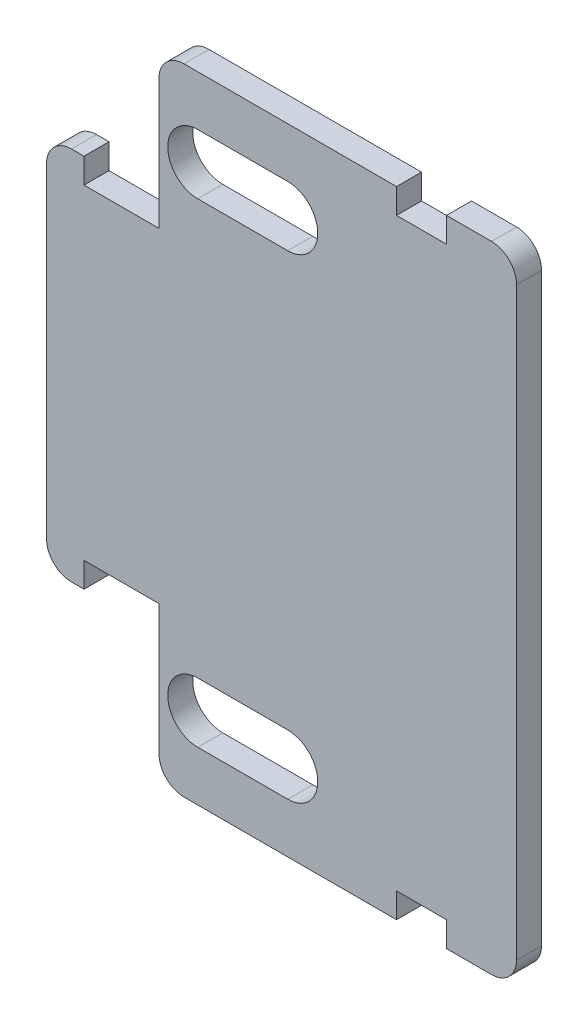
ISO-10303-21;
HEADER;
FILE_DESCRIPTION(('STEP AP214'),'2;1');
FILE_NAME('part.step','',(''),(''),'','','');
FILE_SCHEMA(('AUTOMOTIVE_DESIGN { 1 0 10303 214 1 1 1 1 }'));
ENDSEC;
DATA;
#1=APPLICATION_CONTEXT('core data for automotive mechanical design processes');
#2=APPLICATION_PROTOCOL_DEFINITION('international standard','automotive_design',2000,#1);
#3=PRODUCT_CONTEXT('',#1,'mechanical');
#4=PRODUCT('Part','Part','',(#3));
#5=PRODUCT_RELATED_PRODUCT_CATEGORY('part','',(#4));
#6=PRODUCT_DEFINITION_FORMATION('','',#4);
#7=PRODUCT_DEFINITION_CONTEXT('part definition',#1,'design');
#8=PRODUCT_DEFINITION('design','',#6,#7);
#9=PRODUCT_DEFINITION_SHAPE('','',#8);
#10=(LENGTH_UNIT() NAMED_UNIT(*) SI_UNIT(.MILLI.,.METRE.));
#11=(NAMED_UNIT(*) PLANE_ANGLE_UNIT() SI_UNIT($,.RADIAN.));
#12=(NAMED_UNIT(*) SI_UNIT($,.STERADIAN.) SOLID_ANGLE_UNIT());
#13=UNCERTAINTY_MEASURE_WITH_UNIT(LENGTH_MEASURE(1.E-05),#10,'distance_accuracy_value','');
#14=(GEOMETRIC_REPRESENTATION_CONTEXT(3) GLOBAL_UNCERTAINTY_ASSIGNED_CONTEXT((#13)) GLOBAL_UNIT_ASSIGNED_CONTEXT((#10,
#11,#12)) REPRESENTATION_CONTEXT('',''));
#15=CARTESIAN_POINT('',(0.,0.,0.));
#16=DIRECTION('',(0.,0.,1.));
#17=DIRECTION('',(1.,0.,0.));
#18=AXIS2_PLACEMENT_3D('',#15,#16,#17);
#19=CARTESIAN_POINT('',(0.,53.5,5.));
#20=DIRECTION('',(0.,1.,0.));
#21=DIRECTION('',(0.,0.,1.));
#22=AXIS2_PLACEMENT_3D('',#19,#20,#21);
#23=PLANE('',#22);
#24=DIRECTION('',(1.,0.,0.));
#25=VECTOR('',#24,1.);
#26=CARTESIAN_POINT('',(0.,53.5,0.));
#27=LINE('',#26,#25);
#28=CARTESIAN_POINT('',(-44.75,53.5,0.));
#29=VERTEX_POINT('',#28);
#30=CARTESIAN_POINT('',(-26.75,53.5,0.));
#31=VERTEX_POINT('',#30);
#32=EDGE_CURVE('E403',#29,#31,#27,.T.);
#33=ORIENTED_EDGE('',*,*,#32,.T.);
#34=DIRECTION('',(0.,0.,-1.));
#35=VECTOR('',#34,1.);
#36=CARTESIAN_POINT('',(-26.75,53.5,5.));
#37=LINE('',#36,#35);
#38=CARTESIAN_POINT('',(-26.75,53.5,5.));
#39=VERTEX_POINT('',#38);
#40=EDGE_CURVE('E302',#39,#31,#37,.T.);
#41=ORIENTED_EDGE('',*,*,#40,.F.);
#42=DIRECTION('',(1.,0.,0.));
#43=VECTOR('',#42,1.);
#44=CARTESIAN_POINT('',(0.,53.5,5.));
#45=LINE('',#44,#43);
#46=CARTESIAN_POINT('',(-44.75,53.5,5.));
#47=VERTEX_POINT('',#46);
#48=EDGE_CURVE('E557',#47,#39,#45,.T.);
#49=ORIENTED_EDGE('',*,*,#48,.F.);
#50=DIRECTION('',(0.,0.,-1.));
#51=VECTOR('',#50,1.);
#52=CARTESIAN_POINT('',(-44.75,53.5,5.));
#53=LINE('',#52,#51);
#54=EDGE_CURVE('E413',#47,#29,#53,.T.);
#55=ORIENTED_EDGE('',*,*,#54,.T.);
#56=EDGE_LOOP('',(#33,#41,#49,#55));
#57=FACE_BOUND('',#56,.T.);
#58=ADVANCED_FACE('F41',(#57),#23,.F.);
#59=CARTESIAN_POINT('',(-26.7499999999999,47.5,5.));
#60=DIRECTION('',(0.,0.,-1.));
#61=DIRECTION('',(-1.,0.,0.));
#62=AXIS2_PLACEMENT_3D('',#59,#60,#61);
#63=CYLINDRICAL_SURFACE('',#62,6.);
#64=CARTESIAN_POINT('',(-26.7499999999999,47.5,0.));
#65=DIRECTION('',(0.,0.,1.));
#66=DIRECTION('',(1.,0.,0.));
#67=AXIS2_PLACEMENT_3D('',#64,#65,#66);
#68=CIRCLE('',#67,6.);
#69=CARTESIAN_POINT('',(-26.75,41.5,0.));
#70=VERTEX_POINT('',#69);
#71=EDGE_CURVE('E406',#31,#70,#68,.F.);
#72=ORIENTED_EDGE('',*,*,#71,.T.);
#73=DIRECTION('',(0.,0.,-1.));
#74=VECTOR('',#73,1.);
#75=CARTESIAN_POINT('',(-26.75,41.5,5.));
#76=LINE('',#75,#74);
#77=CARTESIAN_POINT('',(-26.75,41.5,5.));
#78=VERTEX_POINT('',#77);
#79=EDGE_CURVE('E419',#78,#70,#76,.T.);
#80=ORIENTED_EDGE('',*,*,#79,.F.);
#81=CARTESIAN_POINT('',(-26.7499999999999,47.5,5.));
#82=DIRECTION('',(0.,0.,1.));
#83=DIRECTION('',(1.,0.,0.));
#84=AXIS2_PLACEMENT_3D('',#81,#82,#83);
#85=CIRCLE('',#84,6.);
#86=EDGE_CURVE('E560',#39,#78,#85,.F.);
#87=ORIENTED_EDGE('',*,*,#86,.F.);
#88=ORIENTED_EDGE('',*,*,#40,.T.);
#89=EDGE_LOOP('',(#72,#80,#87,#88));
#90=FACE_BOUND('',#89,.T.);
#91=ADVANCED_FACE('F594',(#90),#63,.F.);
#92=CARTESIAN_POINT('',(0.,41.5,5.));
#93=DIRECTION('',(0.,1.,0.));
#94=DIRECTION('',(0.,0.,1.));
#95=AXIS2_PLACEMENT_3D('',#92,#93,#94);
#96=PLANE('',#95);
#97=DIRECTION('',(1.,0.,0.));
#98=VECTOR('',#97,1.);
#99=CARTESIAN_POINT('',(0.,41.5,0.));
#100=LINE('',#99,#98);
#101=CARTESIAN_POINT('',(-44.75,41.5,0.));
#102=VERTEX_POINT('',#101);
#103=EDGE_CURVE('E409',#102,#70,#100,.T.);
#104=ORIENTED_EDGE('',*,*,#103,.F.);
#105=DIRECTION('',(0.,0.,-1.));
#106=VECTOR('',#105,1.);
#107=CARTESIAN_POINT('',(-44.75,41.5,5.));
#108=LINE('',#107,#106);
#109=CARTESIAN_POINT('',(-44.75,41.5,5.));
#110=VERTEX_POINT('',#109);
#111=EDGE_CURVE('E416',#110,#102,#108,.T.);
#112=ORIENTED_EDGE('',*,*,#111,.F.);
#113=DIRECTION('',(1.,0.,0.));
#114=VECTOR('',#113,1.);
#115=CARTESIAN_POINT('',(0.,41.5,5.));
#116=LINE('',#115,#114);
#117=EDGE_CURVE('E562',#110,#78,#116,.T.);
#118=ORIENTED_EDGE('',*,*,#117,.T.);
#119=ORIENTED_EDGE('',*,*,#79,.T.);
#120=EDGE_LOOP('',(#104,#112,#118,#119));
#121=FACE_BOUND('',#120,.T.);
#122=ADVANCED_FACE('F600',(#121),#96,.T.);
#123=CARTESIAN_POINT('',(-26.7499999999999,-47.5,5.));
#124=DIRECTION('',(0.,0.,-1.));
#125=DIRECTION('',(-1.,0.,0.));
#126=AXIS2_PLACEMENT_3D('',#123,#124,#125);
#127=CYLINDRICAL_SURFACE('',#126,6.);
#128=CARTESIAN_POINT('',(-26.7499999999999,-47.5,0.));
#129=DIRECTION('',(0.,0.,1.));
#130=DIRECTION('',(1.,0.,0.));
#131=AXIS2_PLACEMENT_3D('',#128,#129,#130);
#132=CIRCLE('',#131,6.);
#133=CARTESIAN_POINT('',(-26.75,-53.5,0.));
#134=VERTEX_POINT('',#133);
#135=CARTESIAN_POINT('',(-26.75,-41.5,0.));
#136=VERTEX_POINT('',#135);
#137=EDGE_CURVE('E391',#134,#136,#132,.T.);
#138=ORIENTED_EDGE('',*,*,#137,.F.);
#139=DIRECTION('',(0.,0.,-1.));
#140=VECTOR('',#139,1.);
#141=CARTESIAN_POINT('',(-26.75,-53.5,5.));
#142=LINE('',#141,#140);
#143=CARTESIAN_POINT('',(-26.75,-53.5,5.));
#144=VERTEX_POINT('',#143);
#145=EDGE_CURVE('E417',#144,#134,#142,.T.);
#146=ORIENTED_EDGE('',*,*,#145,.F.);
#147=CARTESIAN_POINT('',(-26.7499999999999,-47.5,5.));
#148=DIRECTION('',(0.,0.,1.));
#149=DIRECTION('',(1.,0.,0.));
#150=AXIS2_PLACEMENT_3D('',#147,#148,#149);
#151=CIRCLE('',#150,6.);
#152=CARTESIAN_POINT('',(-26.75,-41.5,5.));
#153=VERTEX_POINT('',#152);
#154=EDGE_CURVE('E546',#144,#153,#151,.T.);
#155=ORIENTED_EDGE('',*,*,#154,.T.);
#156=DIRECTION('',(0.,0.,-1.));
#157=VECTOR('',#156,1.);
#158=CARTESIAN_POINT('',(-26.75,-41.5,5.));
#159=LINE('',#158,#157);
#160=EDGE_CURVE('E290',#153,#136,#159,.T.);
#161=ORIENTED_EDGE('',*,*,#160,.T.);
#162=EDGE_LOOP('',(#138,#146,#155,#161));
#163=FACE_BOUND('',#162,.T.);
#164=ADVANCED_FACE('F618',(#163),#127,.F.);
#165=CARTESIAN_POINT('',(0.,-53.5,5.));
#166=DIRECTION('',(0.,1.,0.));
#167=DIRECTION('',(0.,0.,1.));
#168=AXIS2_PLACEMENT_3D('',#165,#166,#167);
#169=PLANE('',#168);
#170=DIRECTION('',(1.,0.,0.));
#171=VECTOR('',#170,1.);
#172=CARTESIAN_POINT('',(0.,-53.5,0.));
#173=LINE('',#172,#171);
#174=CARTESIAN_POINT('',(-44.75,-53.5,0.));
#175=VERTEX_POINT('',#174);
#176=EDGE_CURVE('E394',#175,#134,#173,.T.);
#177=ORIENTED_EDGE('',*,*,#176,.F.);
#178=DIRECTION('',(0.,0.,-1.));
#179=VECTOR('',#178,1.);
#180=CARTESIAN_POINT('',(-44.75,-53.5,5.));
#181=LINE('',#180,#179);
#182=CARTESIAN_POINT('',(-44.75,-53.5,5.));
#183=VERTEX_POINT('',#182);
#184=EDGE_CURVE('E424',#183,#175,#181,.T.);
#185=ORIENTED_EDGE('',*,*,#184,.F.);
#186=DIRECTION('',(1.,0.,0.));
#187=VECTOR('',#186,1.);
#188=CARTESIAN_POINT('',(0.,-53.5,5.));
#189=LINE('',#188,#187);
#190=EDGE_CURVE('E549',#183,#144,#189,.T.);
#191=ORIENTED_EDGE('',*,*,#190,.T.);
#192=ORIENTED_EDGE('',*,*,#145,.T.);
#193=EDGE_LOOP('',(#177,#185,#191,#192));
#194=FACE_BOUND('',#193,.T.);
#195=ADVANCED_FACE('F614',(#194),#169,.T.);
#196=CARTESIAN_POINT('',(-44.7500000000001,-47.5,5.));
#197=DIRECTION('',(0.,0.,-1.));
#198=DIRECTION('',(-1.,0.,0.));
#199=AXIS2_PLACEMENT_3D('',#196,#197,#198);
#200=CYLINDRICAL_SURFACE('',#199,6.);
#201=CARTESIAN_POINT('',(-44.7500000000001,-47.5,0.));
#202=DIRECTION('',(0.,0.,1.));
#203=DIRECTION('',(1.,0.,0.));
#204=AXIS2_PLACEMENT_3D('',#201,#202,#203);
#205=CIRCLE('',#204,6.);
#206=CARTESIAN_POINT('',(-44.7500000000001,-41.5,0.));
#207=VERTEX_POINT('',#206);
#208=EDGE_CURVE('E397',#207,#175,#205,.T.);
#209=ORIENTED_EDGE('',*,*,#208,.F.);
#210=DIRECTION('',(0.,0.,-1.));
#211=VECTOR('',#210,1.);
#212=CARTESIAN_POINT('',(-44.7500000000001,-41.5,5.));
#213=LINE('',#212,#211);
#214=CARTESIAN_POINT('',(-44.7500000000001,-41.5,5.));
#215=VERTEX_POINT('',#214);
#216=EDGE_CURVE('E293',#215,#207,#213,.T.);
#217=ORIENTED_EDGE('',*,*,#216,.F.);
#218=CARTESIAN_POINT('',(-44.7500000000001,-47.5,5.));
#219=DIRECTION('',(0.,0.,1.));
#220=DIRECTION('',(1.,0.,0.));
#221=AXIS2_PLACEMENT_3D('',#218,#219,#220);
#222=CIRCLE('',#221,6.);
#223=EDGE_CURVE('E552',#215,#183,#222,.T.);
#224=ORIENTED_EDGE('',*,*,#223,.T.);
#225=ORIENTED_EDGE('',*,*,#184,.T.);
#226=EDGE_LOOP('',(#209,#217,#224,#225));
#227=FACE_BOUND('',#226,.T.);
#228=ADVANCED_FACE('F611',(#227),#200,.F.);
#229=CARTESIAN_POINT('',(-5.,0.,5.));
#230=DIRECTION('',(-1.,0.,0.));
#231=DIRECTION('',(0.,0.,1.));
#232=AXIS2_PLACEMENT_3D('',#229,#230,#231);
#233=PLANE('',#232);
#234=DIRECTION('',(0.,1.,0.));
#235=VECTOR('',#234,1.);
#236=CARTESIAN_POINT('',(-5.,0.,0.));
#237=LINE('',#236,#235);
#238=CARTESIAN_POINT('',(-5.,58.5,0.));
#239=VERTEX_POINT('',#238);
#240=CARTESIAN_POINT('',(-5.,63.5,0.));
#241=VERTEX_POINT('',#240);
#242=EDGE_CURVE('E289',#239,#241,#237,.T.);
#243=ORIENTED_EDGE('',*,*,#242,.T.);
#244=DIRECTION('',(0.,0.,-1.));
#245=VECTOR('',#244,1.);
#246=CARTESIAN_POINT('',(-5.,63.5,5.));
#247=LINE('',#246,#245);
#248=CARTESIAN_POINT('',(-5.,63.5,5.));
#249=VERTEX_POINT('',#248);
#250=EDGE_CURVE('E267',#249,#241,#247,.T.);
#251=ORIENTED_EDGE('',*,*,#250,.F.);
#252=DIRECTION('',(0.,1.,0.));
#253=VECTOR('',#252,1.);
#254=CARTESIAN_POINT('',(-5.,0.,5.));
#255=LINE('',#254,#253);
#256=CARTESIAN_POINT('',(-5.,58.5,5.));
#257=VERTEX_POINT('',#256);
#258=EDGE_CURVE('E273',#257,#249,#255,.T.);
#259=ORIENTED_EDGE('',*,*,#258,.F.);
#260=DIRECTION('',(0.,0.,-1.));
#261=VECTOR('',#260,1.);
#262=CARTESIAN_POINT('',(-5.,58.5,5.));
#263=LINE('',#262,#261);
#264=EDGE_CURVE('E427',#257,#239,#263,.T.);
#265=ORIENTED_EDGE('',*,*,#264,.T.);
#266=EDGE_LOOP('',(#243,#251,#259,#265));
#267=FACE_BOUND('',#266,.T.);
#268=ADVANCED_FACE('F287',(#267),#233,.F.);
#269=CARTESIAN_POINT('',(0.,63.5,5.));
#270=DIRECTION('',(0.,-1.,0.));
#271=DIRECTION('',(1.,0.,0.));
#272=AXIS2_PLACEMENT_3D('',#269,#270,#271);
#273=PLANE('',#272);
#274=DIRECTION('',(-1.,0.,0.));
#275=VECTOR('',#274,1.);
#276=CARTESIAN_POINT('',(0.,63.5,0.));
#277=LINE('',#276,#275);
#278=CARTESIAN_POINT('',(-47.5,63.5,0.));
#279=VERTEX_POINT('',#278);
#280=EDGE_CURVE('E567',#241,#279,#277,.T.);
#281=ORIENTED_EDGE('',*,*,#280,.T.);
#282=DIRECTION('',(0.,0.,-1.));
#283=VECTOR('',#282,1.);
#284=CARTESIAN_POINT('',(-47.5,63.5,5.));
#285=LINE('',#284,#283);
#286=CARTESIAN_POINT('',(-47.5,63.5,5.));
#287=VERTEX_POINT('',#286);
#288=EDGE_CURVE('E270',#279,#287,#285,.F.);
#289=ORIENTED_EDGE('',*,*,#288,.T.);
#290=DIRECTION('',(-1.,0.,0.));
#291=VECTOR('',#290,1.);
#292=CARTESIAN_POINT('',(0.,63.5,5.));
#293=LINE('',#292,#291);
#294=EDGE_CURVE('E262',#249,#287,#293,.T.);
#295=ORIENTED_EDGE('',*,*,#294,.F.);
#296=ORIENTED_EDGE('',*,*,#250,.T.);
#297=EDGE_LOOP('',(#281,#289,#295,#296));
#298=FACE_BOUND('',#297,.T.);
#299=ADVANCED_FACE('F265',(#298),#273,.F.);
#300=CARTESIAN_POINT('',(-52.5,0.,5.));
#301=DIRECTION('',(-1.,0.,0.));
#302=DIRECTION('',(0.,0.,1.));
#303=AXIS2_PLACEMENT_3D('',#300,#301,#302);
#304=PLANE('',#303);
#305=DIRECTION('',(0.,1.,0.));
#306=VECTOR('',#305,1.);
#307=CARTESIAN_POINT('',(-52.5,0.,5.));
#308=LINE('',#307,#306);
#309=CARTESIAN_POINT('',(-52.5,32.5,5.));
#310=VERTEX_POINT('',#309);
#311=CARTESIAN_POINT('',(-52.5,58.5,5.));
#312=VERTEX_POINT('',#311);
#313=EDGE_CURVE('E272',#310,#312,#308,.T.);
#314=ORIENTED_EDGE('',*,*,#313,.T.);
#315=DIRECTION('',(0.,0.,-1.));
#316=VECTOR('',#315,1.);
#317=CARTESIAN_POINT('',(-52.5,58.5,0.));
#318=LINE('',#317,#316);
#319=CARTESIAN_POINT('',(-52.5,58.5,0.));
#320=VERTEX_POINT('',#319);
#321=EDGE_CURVE('E332',#312,#320,#318,.T.);
#322=ORIENTED_EDGE('',*,*,#321,.T.);
#323=DIRECTION('',(0.,1.,0.));
#324=VECTOR('',#323,1.);
#325=CARTESIAN_POINT('',(-52.5,0.,0.));
#326=LINE('',#325,#324);
#327=CARTESIAN_POINT('',(-52.5,32.5,0.));
#328=VERTEX_POINT('',#327);
#329=EDGE_CURVE('E474',#328,#320,#326,.T.);
#330=ORIENTED_EDGE('',*,*,#329,.F.);
#331=DIRECTION('',(0.,0.,-1.));
#332=VECTOR('',#331,1.);
#333=CARTESIAN_POINT('',(-52.5,32.5,5.));
#334=LINE('',#333,#332);
#335=EDGE_CURVE('E291',#310,#328,#334,.T.);
#336=ORIENTED_EDGE('',*,*,#335,.F.);
#337=EDGE_LOOP('',(#314,#322,#330,#336));
#338=FACE_BOUND('',#337,.T.);
#339=ADVANCED_FACE('F570',(#338),#304,.T.);
#340=CARTESIAN_POINT('',(0.,32.5,5.));
#341=DIRECTION('',(0.,-1.,0.));
#342=DIRECTION('',(0.,0.,-1.));
#343=AXIS2_PLACEMENT_3D('',#340,#341,#342);
#344=PLANE('',#343);
#345=DIRECTION('',(-1.,0.,0.));
#346=VECTOR('',#345,1.);
#347=CARTESIAN_POINT('',(0.,32.5,0.));
#348=LINE('',#347,#346);
#349=CARTESIAN_POINT('',(-67.5,32.5,0.));
#350=VERTEX_POINT('',#349);
#351=EDGE_CURVE('E467',#328,#350,#348,.T.);
#352=ORIENTED_EDGE('',*,*,#351,.T.);
#353=DIRECTION('',(0.,0.,-1.));
#354=VECTOR('',#353,1.);
#355=CARTESIAN_POINT('',(-67.5,32.5,5.));
#356=LINE('',#355,#354);
#357=CARTESIAN_POINT('',(-67.5,32.5,5.));
#358=VERTEX_POINT('',#357);
#359=EDGE_CURVE('E295',#358,#350,#356,.T.);
#360=ORIENTED_EDGE('',*,*,#359,.F.);
#361=DIRECTION('',(-1.,0.,0.));
#362=VECTOR('',#361,1.);
#363=CARTESIAN_POINT('',(0.,32.5,5.));
#364=LINE('',#363,#362);
#365=EDGE_CURVE('E575',#310,#358,#364,.T.);
#366=ORIENTED_EDGE('',*,*,#365,.F.);
#367=ORIENTED_EDGE('',*,*,#335,.T.);
#368=EDGE_LOOP('',(#352,#360,#366,#367));
#369=FACE_BOUND('',#368,.T.);
#370=ADVANCED_FACE('F672',(#369),#344,.F.);
#371=CARTESIAN_POINT('',(-67.5,0.,5.));
#372=DIRECTION('',(-1.,0.,0.));
#373=DIRECTION('',(0.,0.,1.));
#374=AXIS2_PLACEMENT_3D('',#371,#372,#373);
#375=PLANE('',#374);
#376=DIRECTION('',(0.,1.,0.));
#377=VECTOR('',#376,1.);
#378=CARTESIAN_POINT('',(-67.5,0.,0.));
#379=LINE('',#378,#377);
#380=CARTESIAN_POINT('',(-67.5,37.5,0.));
#381=VERTEX_POINT('',#380);
#382=EDGE_CURVE('E460',#350,#381,#379,.T.);
#383=ORIENTED_EDGE('',*,*,#382,.T.);
#384=DIRECTION('',(0.,0.,-1.));
#385=VECTOR('',#384,1.);
#386=CARTESIAN_POINT('',(-67.5,37.5,5.));
#387=LINE('',#386,#385);
#388=CARTESIAN_POINT('',(-67.5,37.5,5.));
#389=VERTEX_POINT('',#388);
#390=EDGE_CURVE('E451',#389,#381,#387,.T.);
#391=ORIENTED_EDGE('',*,*,#390,.F.);
#392=DIRECTION('',(0.,1.,0.));
#393=VECTOR('',#392,1.);
#394=CARTESIAN_POINT('',(-67.5,0.,5.));
#395=LINE('',#394,#393);
#396=EDGE_CURVE('E461',#358,#389,#395,.T.);
#397=ORIENTED_EDGE('',*,*,#396,.F.);
#398=ORIENTED_EDGE('',*,*,#359,.T.);
#399=EDGE_LOOP('',(#383,#391,#397,#398));
#400=FACE_BOUND('',#399,.T.);
#401=ADVANCED_FACE('F458',(#400),#375,.F.);
#402=CARTESIAN_POINT('',(0.,37.5,5.));
#403=DIRECTION('',(0.,-1.,0.));
#404=DIRECTION('',(0.,0.,-1.));
#405=AXIS2_PLACEMENT_3D('',#402,#403,#404);
#406=PLANE('',#405);
#407=DIRECTION('',(-1.,0.,0.));
#408=VECTOR('',#407,1.);
#409=CARTESIAN_POINT('',(0.,37.5,0.));
#410=LINE('',#409,#408);
#411=CARTESIAN_POINT('',(-70.,37.5,0.));
#412=VERTEX_POINT('',#411);
#413=EDGE_CURVE('E470',#381,#412,#410,.T.);
#414=ORIENTED_EDGE('',*,*,#413,.T.);
#415=DIRECTION('',(0.,0.,-1.));
#416=VECTOR('',#415,1.);
#417=CARTESIAN_POINT('',(-70.,37.5,5.));
#418=LINE('',#417,#416);
#419=CARTESIAN_POINT('',(-70.,37.5,5.));
#420=VERTEX_POINT('',#419);
#421=EDGE_CURVE('E317',#412,#420,#418,.F.);
#422=ORIENTED_EDGE('',*,*,#421,.T.);
#423=DIRECTION('',(-1.,0.,0.));
#424=VECTOR('',#423,1.);
#425=CARTESIAN_POINT('',(0.,37.5,5.));
#426=LINE('',#425,#424);
#427=EDGE_CURVE('E516',#389,#420,#426,.T.);
#428=ORIENTED_EDGE('',*,*,#427,.F.);
#429=ORIENTED_EDGE('',*,*,#390,.T.);
#430=EDGE_LOOP('',(#414,#422,#428,#429));
#431=FACE_BOUND('',#430,.T.);
#432=ADVANCED_FACE('F580',(#431),#406,.F.);
#433=CARTESIAN_POINT('',(-75.,0.,5.));
#434=DIRECTION('',(1.,0.,0.));
#435=DIRECTION('',(0.,0.,-1.));
#436=AXIS2_PLACEMENT_3D('',#433,#434,#435);
#437=PLANE('',#436);
#438=DIRECTION('',(0.,-1.,0.));
#439=VECTOR('',#438,1.);
#440=CARTESIAN_POINT('',(-75.,0.,5.));
#441=LINE('',#440,#439);
#442=CARTESIAN_POINT('',(-75.,32.5,5.));
#443=VERTEX_POINT('',#442);
#444=CARTESIAN_POINT('',(-75.,-32.5,5.));
#445=VERTEX_POINT('',#444);
#446=EDGE_CURVE('E514',#443,#445,#441,.T.);
#447=ORIENTED_EDGE('',*,*,#446,.F.);
#448=DIRECTION('',(0.,0.,-1.));
#449=VECTOR('',#448,1.);
#450=CARTESIAN_POINT('',(-75.,32.5,5.));
#451=LINE('',#450,#449);
#452=CARTESIAN_POINT('',(-75.,32.5,0.));
#453=VERTEX_POINT('',#452);
#454=EDGE_CURVE('E301',#443,#453,#451,.T.);
#455=ORIENTED_EDGE('',*,*,#454,.T.);
#456=DIRECTION('',(0.,-1.,0.));
#457=VECTOR('',#456,1.);
#458=CARTESIAN_POINT('',(-75.,0.,0.));
#459=LINE('',#458,#457);
#460=CARTESIAN_POINT('',(-75.,-32.5,0.));
#461=VERTEX_POINT('',#460);
#462=EDGE_CURVE('E472',#453,#461,#459,.T.);
#463=ORIENTED_EDGE('',*,*,#462,.T.);
#464=DIRECTION('',(0.,0.,-1.));
#465=VECTOR('',#464,1.);
#466=CARTESIAN_POINT('',(-75.,-32.5,5.));
#467=LINE('',#466,#465);
#468=EDGE_CURVE('E299',#461,#445,#467,.F.);
#469=ORIENTED_EDGE('',*,*,#468,.T.);
#470=EDGE_LOOP('',(#447,#455,#463,#469));
#471=FACE_BOUND('',#470,.T.);
#472=ADVANCED_FACE('F509',(#471),#437,.F.);
#473=CARTESIAN_POINT('',(0.,-37.5,5.));
#474=DIRECTION('',(0.,1.,0.));
#475=DIRECTION('',(0.,0.,1.));
#476=AXIS2_PLACEMENT_3D('',#473,#474,#475);
#477=PLANE('',#476);
#478=DIRECTION('',(1.,0.,0.));
#479=VECTOR('',#478,1.);
#480=CARTESIAN_POINT('',(0.,-37.5,5.));
#481=LINE('',#480,#479);
#482=CARTESIAN_POINT('',(-70.,-37.5,5.));
#483=VERTEX_POINT('',#482);
#484=CARTESIAN_POINT('',(-67.5,-37.5,5.));
#485=VERTEX_POINT('',#484);
#486=EDGE_CURVE('E503',#483,#485,#481,.T.);
#487=ORIENTED_EDGE('',*,*,#486,.F.);
#488=DIRECTION('',(0.,0.,-1.));
#489=VECTOR('',#488,1.);
#490=CARTESIAN_POINT('',(-70.,-37.5,5.));
#491=LINE('',#490,#489);
#492=CARTESIAN_POINT('',(-70.,-37.5,0.));
#493=VERTEX_POINT('',#492);
#494=EDGE_CURVE('E329',#483,#493,#491,.T.);
#495=ORIENTED_EDGE('',*,*,#494,.T.);
#496=DIRECTION('',(1.,0.,0.));
#497=VECTOR('',#496,1.);
#498=CARTESIAN_POINT('',(0.,-37.5,0.));
#499=LINE('',#498,#497);
#500=CARTESIAN_POINT('',(-67.5,-37.5,0.));
#501=VERTEX_POINT('',#500);
#502=EDGE_CURVE('E480',#493,#501,#499,.T.);
#503=ORIENTED_EDGE('',*,*,#502,.T.);
#504=DIRECTION('',(0.,0.,-1.));
#505=VECTOR('',#504,1.);
#506=CARTESIAN_POINT('',(-67.5,-37.5,5.));
#507=LINE('',#506,#505);
#508=EDGE_CURVE('E448',#485,#501,#507,.T.);
#509=ORIENTED_EDGE('',*,*,#508,.F.);
#510=EDGE_LOOP('',(#487,#495,#503,#509));
#511=FACE_BOUND('',#510,.T.);
#512=ADVANCED_FACE('F502',(#511),#477,.F.);
#513=CARTESIAN_POINT('',(-67.5,0.,5.));
#514=DIRECTION('',(1.,0.,0.));
#515=DIRECTION('',(0.,0.,-1.));
#516=AXIS2_PLACEMENT_3D('',#513,#514,#515);
#517=PLANE('',#516);
#518=DIRECTION('',(0.,-1.,0.));
#519=VECTOR('',#518,1.);
#520=CARTESIAN_POINT('',(-67.5,0.,0.));
#521=LINE('',#520,#519);
#522=CARTESIAN_POINT('',(-67.5,-32.5,0.));
#523=VERTEX_POINT('',#522);
#524=EDGE_CURVE('E482',#523,#501,#521,.T.);
#525=ORIENTED_EDGE('',*,*,#524,.F.);
#526=DIRECTION('',(0.,0.,-1.));
#527=VECTOR('',#526,1.);
#528=CARTESIAN_POINT('',(-67.5,-32.5,5.));
#529=LINE('',#528,#527);
#530=CARTESIAN_POINT('',(-67.5,-32.5,5.));
#531=VERTEX_POINT('',#530);
#532=EDGE_CURVE('E446',#531,#523,#529,.T.);
#533=ORIENTED_EDGE('',*,*,#532,.F.);
#534=DIRECTION('',(0.,-1.,0.));
#535=VECTOR('',#534,1.);
#536=CARTESIAN_POINT('',(-67.5,0.,5.));
#537=LINE('',#536,#535);
#538=EDGE_CURVE('E499',#531,#485,#537,.T.);
#539=ORIENTED_EDGE('',*,*,#538,.T.);
#540=ORIENTED_EDGE('',*,*,#508,.T.);
#541=EDGE_LOOP('',(#525,#533,#539,#540));
#542=FACE_BOUND('',#541,.T.);
#543=ADVANCED_FACE('F497',(#542),#517,.T.);
#544=CARTESIAN_POINT('',(0.,-32.5,5.));
#545=DIRECTION('',(0.,-1.,0.));
#546=DIRECTION('',(0.,0.,-1.));
#547=AXIS2_PLACEMENT_3D('',#544,#545,#546);
#548=PLANE('',#547);
#549=DIRECTION('',(-1.,0.,0.));
#550=VECTOR('',#549,1.);
#551=CARTESIAN_POINT('',(0.,-32.5,0.));
#552=LINE('',#551,#550);
#553=CARTESIAN_POINT('',(-52.5,-32.5,0.));
#554=VERTEX_POINT('',#553);
#555=EDGE_CURVE('E371',#554,#523,#552,.T.);
#556=ORIENTED_EDGE('',*,*,#555,.F.);
#557=DIRECTION('',(0.,0.,-1.));
#558=VECTOR('',#557,1.);
#559=CARTESIAN_POINT('',(-52.5,-32.5,5.));
#560=LINE('',#559,#558);
#561=CARTESIAN_POINT('',(-52.5,-32.5,5.));
#562=VERTEX_POINT('',#561);
#563=EDGE_CURVE('E444',#562,#554,#560,.T.);
#564=ORIENTED_EDGE('',*,*,#563,.F.);
#565=DIRECTION('',(-1.,0.,0.));
#566=VECTOR('',#565,1.);
#567=CARTESIAN_POINT('',(0.,-32.5,5.));
#568=LINE('',#567,#566);
#569=EDGE_CURVE('E493',#562,#531,#568,.T.);
#570=ORIENTED_EDGE('',*,*,#569,.T.);
#571=ORIENTED_EDGE('',*,*,#532,.T.);
#572=EDGE_LOOP('',(#556,#564,#570,#571));
#573=FACE_BOUND('',#572,.T.);
#574=ADVANCED_FACE('F489',(#573),#548,.T.);
#575=CARTESIAN_POINT('',(-52.5,0.,5.));
#576=DIRECTION('',(1.,0.,0.));
#577=DIRECTION('',(0.,0.,-1.));
#578=AXIS2_PLACEMENT_3D('',#575,#576,#577);
#579=PLANE('',#578);
#580=DIRECTION('',(0.,-1.,0.));
#581=VECTOR('',#580,1.);
#582=CARTESIAN_POINT('',(-52.5,0.,0.));
#583=LINE('',#582,#581);
#584=CARTESIAN_POINT('',(-52.5,-58.5,0.));
#585=VERTEX_POINT('',#584);
#586=EDGE_CURVE('E367',#554,#585,#583,.T.);
#587=ORIENTED_EDGE('',*,*,#586,.T.);
#588=DIRECTION('',(0.,0.,-1.));
#589=VECTOR('',#588,1.);
#590=CARTESIAN_POINT('',(-52.5,-58.5,5.));
#591=LINE('',#590,#589);
#592=CARTESIAN_POINT('',(-52.5,-58.5,5.));
#593=VERTEX_POINT('',#592);
#594=EDGE_CURVE('E11',#585,#593,#591,.F.);
#595=ORIENTED_EDGE('',*,*,#594,.T.);
#596=DIRECTION('',(0.,-1.,0.));
#597=VECTOR('',#596,1.);
#598=CARTESIAN_POINT('',(-52.5,0.,5.));
#599=LINE('',#598,#597);
#600=EDGE_CURVE('E524',#562,#593,#599,.T.);
#601=ORIENTED_EDGE('',*,*,#600,.F.);
#602=ORIENTED_EDGE('',*,*,#563,.T.);
#603=EDGE_LOOP('',(#587,#595,#601,#602));
#604=FACE_BOUND('',#603,.T.);
#605=ADVANCED_FACE('F656',(#604),#579,.F.);
#606=CARTESIAN_POINT('',(0.,-63.5,5.));
#607=DIRECTION('',(0.,1.,0.));
#608=DIRECTION('',(-1.,0.,0.));
#609=AXIS2_PLACEMENT_3D('',#606,#607,#608);
#610=PLANE('',#609);
#611=DIRECTION('',(1.,0.,0.));
#612=VECTOR('',#611,1.);
#613=CARTESIAN_POINT('',(0.,-63.5,5.));
#614=LINE('',#613,#612);
#615=CARTESIAN_POINT('',(-47.5,-63.5,5.));
#616=VERTEX_POINT('',#615);
#617=CARTESIAN_POINT('',(-5.,-63.5,5.));
#618=VERTEX_POINT('',#617);
#619=EDGE_CURVE('E354',#616,#618,#614,.T.);
#620=ORIENTED_EDGE('',*,*,#619,.F.);
#621=DIRECTION('',(0.,0.,-1.));
#622=VECTOR('',#621,1.);
#623=CARTESIAN_POINT('',(-47.5,-63.5,5.));
#624=LINE('',#623,#622);
#625=CARTESIAN_POINT('',(-47.5,-63.5,0.));
#626=VERTEX_POINT('',#625);
#627=EDGE_CURVE('E49',#616,#626,#624,.T.);
#628=ORIENTED_EDGE('',*,*,#627,.T.);
#629=DIRECTION('',(1.,0.,0.));
#630=VECTOR('',#629,1.);
#631=CARTESIAN_POINT('',(0.,-63.5,0.));
#632=LINE('',#631,#630);
#633=CARTESIAN_POINT('',(-5.,-63.5,0.));
#634=VERTEX_POINT('',#633);
#635=EDGE_CURVE('E352',#626,#634,#632,.T.);
#636=ORIENTED_EDGE('',*,*,#635,.T.);
#637=DIRECTION('',(0.,0.,-1.));
#638=VECTOR('',#637,1.);
#639=CARTESIAN_POINT('',(-5.,-63.5,5.));
#640=LINE('',#639,#638);
#641=EDGE_CURVE('E442',#618,#634,#640,.T.);
#642=ORIENTED_EDGE('',*,*,#641,.F.);
#643=EDGE_LOOP('',(#620,#628,#636,#642));
#644=FACE_BOUND('',#643,.T.);
#645=ADVANCED_FACE('F350',(#644),#610,.F.);
#646=CARTESIAN_POINT('',(-5.,0.,5.));
#647=DIRECTION('',(1.,0.,0.));
#648=DIRECTION('',(0.,0.,-1.));
#649=AXIS2_PLACEMENT_3D('',#646,#647,#648);
#650=PLANE('',#649);
#651=DIRECTION('',(0.,-1.,0.));
#652=VECTOR('',#651,1.);
#653=CARTESIAN_POINT('',(-5.,0.,0.));
#654=LINE('',#653,#652);
#655=CARTESIAN_POINT('',(-5.,-58.5,0.));
#656=VERTEX_POINT('',#655);
#657=EDGE_CURVE('E366',#656,#634,#654,.T.);
#658=ORIENTED_EDGE('',*,*,#657,.F.);
#659=DIRECTION('',(0.,0.,-1.));
#660=VECTOR('',#659,1.);
#661=CARTESIAN_POINT('',(-5.,-58.5,5.));
#662=LINE('',#661,#660);
#663=CARTESIAN_POINT('',(-5.,-58.5,5.));
#664=VERTEX_POINT('',#663);
#665=EDGE_CURVE('E440',#664,#656,#662,.T.);
#666=ORIENTED_EDGE('',*,*,#665,.F.);
#667=DIRECTION('',(0.,-1.,0.));
#668=VECTOR('',#667,1.);
#669=CARTESIAN_POINT('',(-5.,0.,5.));
#670=LINE('',#669,#668);
#671=EDGE_CURVE('E528',#664,#618,#670,.T.);
#672=ORIENTED_EDGE('',*,*,#671,.T.);
#673=ORIENTED_EDGE('',*,*,#641,.T.);
#674=EDGE_LOOP('',(#658,#666,#672,#673));
#675=FACE_BOUND('',#674,.T.);
#676=ADVANCED_FACE('F649',(#675),#650,.T.);
#677=CARTESIAN_POINT('',(0.,-58.5,5.));
#678=DIRECTION('',(0.,-1.,0.));
#679=DIRECTION('',(0.,0.,-1.));
#680=AXIS2_PLACEMENT_3D('',#677,#678,#679);
#681=PLANE('',#680);
#682=DIRECTION('',(-1.,0.,0.));
#683=VECTOR('',#682,1.);
#684=CARTESIAN_POINT('',(0.,-58.5,0.));
#685=LINE('',#684,#683);
#686=CARTESIAN_POINT('',(5.,-58.5,0.));
#687=VERTEX_POINT('',#686);
#688=EDGE_CURVE('E369',#687,#656,#685,.T.);
#689=ORIENTED_EDGE('',*,*,#688,.F.);
#690=DIRECTION('',(0.,0.,-1.));
#691=VECTOR('',#690,1.);
#692=CARTESIAN_POINT('',(5.,-58.5,5.));
#693=LINE('',#692,#691);
#694=CARTESIAN_POINT('',(5.,-58.5,5.));
#695=VERTEX_POINT('',#694);
#696=EDGE_CURVE('E438',#695,#687,#693,.T.);
#697=ORIENTED_EDGE('',*,*,#696,.F.);
#698=DIRECTION('',(-1.,0.,0.));
#699=VECTOR('',#698,1.);
#700=CARTESIAN_POINT('',(0.,-58.5,5.));
#701=LINE('',#700,#699);
#702=EDGE_CURVE('E531',#695,#664,#701,.T.);
#703=ORIENTED_EDGE('',*,*,#702,.T.);
#704=ORIENTED_EDGE('',*,*,#665,.T.);
#705=EDGE_LOOP('',(#689,#697,#703,#704));
#706=FACE_BOUND('',#705,.T.);
#707=ADVANCED_FACE('F645',(#706),#681,.T.);
#708=CARTESIAN_POINT('',(5.,0.,5.));
#709=DIRECTION('',(1.,0.,0.));
#710=DIRECTION('',(0.,0.,-1.));
#711=AXIS2_PLACEMENT_3D('',#708,#709,#710);
#712=PLANE('',#711);
#713=DIRECTION('',(0.,-1.,0.));
#714=VECTOR('',#713,1.);
#715=CARTESIAN_POINT('',(5.,0.,0.));
#716=LINE('',#715,#714);
#717=CARTESIAN_POINT('',(5.,-63.5,0.));
#718=VERTEX_POINT('',#717);
#719=EDGE_CURVE('E376',#687,#718,#716,.T.);
#720=ORIENTED_EDGE('',*,*,#719,.T.);
#721=DIRECTION('',(0.,0.,-1.));
#722=VECTOR('',#721,1.);
#723=CARTESIAN_POINT('',(5.,-63.5,5.));
#724=LINE('',#723,#722);
#725=CARTESIAN_POINT('',(5.,-63.5,5.));
#726=VERTEX_POINT('',#725);
#727=EDGE_CURVE('E435',#726,#718,#724,.T.);
#728=ORIENTED_EDGE('',*,*,#727,.F.);
#729=DIRECTION('',(0.,-1.,0.));
#730=VECTOR('',#729,1.);
#731=CARTESIAN_POINT('',(5.,0.,5.));
#732=LINE('',#731,#730);
#733=EDGE_CURVE('E534',#695,#726,#732,.T.);
#734=ORIENTED_EDGE('',*,*,#733,.F.);
#735=ORIENTED_EDGE('',*,*,#696,.T.);
#736=EDGE_LOOP('',(#720,#728,#734,#735));
#737=FACE_BOUND('',#736,.T.);
#738=ADVANCED_FACE('F641',(#737),#712,.F.);
#739=CARTESIAN_POINT('',(0.,-63.5,5.));
#740=DIRECTION('',(0.,1.,0.));
#741=DIRECTION('',(-1.,0.,0.));
#742=AXIS2_PLACEMENT_3D('',#739,#740,#741);
#743=PLANE('',#742);
#744=DIRECTION('',(1.,0.,0.));
#745=VECTOR('',#744,1.);
#746=CARTESIAN_POINT('',(0.,-63.5,0.));
#747=LINE('',#746,#745);
#748=CARTESIAN_POINT('',(14.,-63.5,0.));
#749=VERTEX_POINT('',#748);
#750=EDGE_CURVE('E378',#718,#749,#747,.T.);
#751=ORIENTED_EDGE('',*,*,#750,.T.);
#752=DIRECTION('',(0.,0.,-1.));
#753=VECTOR('',#752,1.);
#754=CARTESIAN_POINT('',(14.,-63.5,5.));
#755=LINE('',#754,#753);
#756=CARTESIAN_POINT('',(14.,-63.5,5.));
#757=VERTEX_POINT('',#756);
#758=EDGE_CURVE('E344',#749,#757,#755,.F.);
#759=ORIENTED_EDGE('',*,*,#758,.T.);
#760=DIRECTION('',(1.,0.,0.));
#761=VECTOR('',#760,1.);
#762=CARTESIAN_POINT('',(0.,-63.5,5.));
#763=LINE('',#762,#761);
#764=EDGE_CURVE('E536',#726,#757,#763,.T.);
#765=ORIENTED_EDGE('',*,*,#764,.F.);
#766=ORIENTED_EDGE('',*,*,#727,.T.);
#767=EDGE_LOOP('',(#751,#759,#765,#766));
#768=FACE_BOUND('',#767,.T.);
#769=ADVANCED_FACE('F637',(#768),#743,.F.);
#770=CARTESIAN_POINT('',(19.,0.,5.));
#771=DIRECTION('',(1.,0.,0.));
#772=DIRECTION('',(0.,1.,0.));
#773=AXIS2_PLACEMENT_3D('',#770,#771,#772);
#774=PLANE('',#773);
#775=DIRECTION('',(0.,-1.,0.));
#776=VECTOR('',#775,1.);
#777=CARTESIAN_POINT('',(19.,0.,0.));
#778=LINE('',#777,#776);
#779=CARTESIAN_POINT('',(19.,58.5,0.));
#780=VERTEX_POINT('',#779);
#781=CARTESIAN_POINT('',(19.,-58.5,0.));
#782=VERTEX_POINT('',#781);
#783=EDGE_CURVE('E381',#780,#782,#778,.T.);
#784=ORIENTED_EDGE('',*,*,#783,.F.);
#785=DIRECTION('',(0.,0.,-1.));
#786=VECTOR('',#785,1.);
#787=CARTESIAN_POINT('',(19.,58.5,5.));
#788=LINE('',#787,#786);
#789=CARTESIAN_POINT('',(19.,58.5,5.));
#790=VERTEX_POINT('',#789);
#791=EDGE_CURVE('E342',#780,#790,#788,.F.);
#792=ORIENTED_EDGE('',*,*,#791,.T.);
#793=DIRECTION('',(0.,-1.,0.));
#794=VECTOR('',#793,1.);
#795=CARTESIAN_POINT('',(19.,0.,5.));
#796=LINE('',#795,#794);
#797=CARTESIAN_POINT('',(19.,-58.5,5.));
#798=VERTEX_POINT('',#797);
#799=EDGE_CURVE('E538',#790,#798,#796,.T.);
#800=ORIENTED_EDGE('',*,*,#799,.T.);
#801=DIRECTION('',(0.,0.,-1.));
#802=VECTOR('',#801,1.);
#803=CARTESIAN_POINT('',(19.,-58.5,0.));
#804=LINE('',#803,#802);
#805=EDGE_CURVE('E339',#798,#782,#804,.T.);
#806=ORIENTED_EDGE('',*,*,#805,.T.);
#807=EDGE_LOOP('',(#784,#792,#800,#806));
#808=FACE_BOUND('',#807,.T.);
#809=ADVANCED_FACE('F633',(#808),#774,.T.);
#810=CARTESIAN_POINT('',(0.,63.5,5.));
#811=DIRECTION('',(0.,-1.,0.));
#812=DIRECTION('',(0.,0.,-1.));
#813=AXIS2_PLACEMENT_3D('',#810,#811,#812);
#814=PLANE('',#813);
#815=DIRECTION('',(-1.,0.,0.));
#816=VECTOR('',#815,1.);
#817=CARTESIAN_POINT('',(0.,63.5,5.));
#818=LINE('',#817,#816);
#819=CARTESIAN_POINT('',(14.,63.5,5.));
#820=VERTEX_POINT('',#819);
#821=CARTESIAN_POINT('',(5.,63.5,5.));
#822=VERTEX_POINT('',#821);
#823=EDGE_CURVE('E540',#820,#822,#818,.T.);
#824=ORIENTED_EDGE('',*,*,#823,.F.);
#825=DIRECTION('',(0.,0.,-1.));
#826=VECTOR('',#825,1.);
#827=CARTESIAN_POINT('',(14.,63.5,0.));
#828=LINE('',#827,#826);
#829=CARTESIAN_POINT('',(14.,63.5,0.));
#830=VERTEX_POINT('',#829);
#831=EDGE_CURVE('E336',#820,#830,#828,.T.);
#832=ORIENTED_EDGE('',*,*,#831,.T.);
#833=DIRECTION('',(-1.,0.,0.));
#834=VECTOR('',#833,1.);
#835=CARTESIAN_POINT('',(0.,63.5,0.));
#836=LINE('',#835,#834);
#837=CARTESIAN_POINT('',(5.,63.5,0.));
#838=VERTEX_POINT('',#837);
#839=EDGE_CURVE('E384',#830,#838,#836,.T.);
#840=ORIENTED_EDGE('',*,*,#839,.T.);
#841=DIRECTION('',(0.,0.,-1.));
#842=VECTOR('',#841,1.);
#843=CARTESIAN_POINT('',(5.,63.5,5.));
#844=LINE('',#843,#842);
#845=EDGE_CURVE('E432',#822,#838,#844,.T.);
#846=ORIENTED_EDGE('',*,*,#845,.F.);
#847=EDGE_LOOP('',(#824,#832,#840,#846));
#848=FACE_BOUND('',#847,.T.);
#849=ADVANCED_FACE('F629',(#848),#814,.F.);
#850=CARTESIAN_POINT('',(5.,0.,5.));
#851=DIRECTION('',(-1.,0.,0.));
#852=DIRECTION('',(0.,0.,1.));
#853=AXIS2_PLACEMENT_3D('',#850,#851,#852);
#854=PLANE('',#853);
#855=DIRECTION('',(0.,1.,0.));
#856=VECTOR('',#855,1.);
#857=CARTESIAN_POINT('',(5.,0.,0.));
#858=LINE('',#857,#856);
#859=CARTESIAN_POINT('',(5.,58.5,0.));
#860=VERTEX_POINT('',#859);
#861=EDGE_CURVE('E386',#860,#838,#858,.T.);
#862=ORIENTED_EDGE('',*,*,#861,.F.);
#863=DIRECTION('',(0.,0.,-1.));
#864=VECTOR('',#863,1.);
#865=CARTESIAN_POINT('',(5.,58.5,5.));
#866=LINE('',#865,#864);
#867=CARTESIAN_POINT('',(5.,58.5,5.));
#868=VERTEX_POINT('',#867);
#869=EDGE_CURVE('E429',#868,#860,#866,.T.);
#870=ORIENTED_EDGE('',*,*,#869,.F.);
#871=DIRECTION('',(0.,1.,0.));
#872=VECTOR('',#871,1.);
#873=CARTESIAN_POINT('',(5.,0.,5.));
#874=LINE('',#873,#872);
#875=EDGE_CURVE('E542',#868,#822,#874,.T.);
#876=ORIENTED_EDGE('',*,*,#875,.T.);
#877=ORIENTED_EDGE('',*,*,#845,.T.);
#878=EDGE_LOOP('',(#862,#870,#876,#877));
#879=FACE_BOUND('',#878,.T.);
#880=ADVANCED_FACE('F609',(#879),#854,.T.);
#881=CARTESIAN_POINT('',(0.,-41.5,5.));
#882=DIRECTION('',(0.,1.,0.));
#883=DIRECTION('',(0.,0.,1.));
#884=AXIS2_PLACEMENT_3D('',#881,#882,#883);
#885=PLANE('',#884);
#886=DIRECTION('',(1.,0.,0.));
#887=VECTOR('',#886,1.);
#888=CARTESIAN_POINT('',(0.,-41.5,0.));
#889=LINE('',#888,#887);
#890=EDGE_CURVE('E400',#207,#136,#889,.T.);
#891=ORIENTED_EDGE('',*,*,#890,.T.);
#892=ORIENTED_EDGE('',*,*,#160,.F.);
#893=DIRECTION('',(1.,0.,0.));
#894=VECTOR('',#893,1.);
#895=CARTESIAN_POINT('',(0.,-41.5,5.));
#896=LINE('',#895,#894);
#897=EDGE_CURVE('E555',#215,#153,#896,.T.);
#898=ORIENTED_EDGE('',*,*,#897,.F.);
#899=ORIENTED_EDGE('',*,*,#216,.T.);
#900=EDGE_LOOP('',(#891,#892,#898,#899));
#901=FACE_BOUND('',#900,.T.);
#902=ADVANCED_FACE('F605',(#901),#885,.F.);
#903=CARTESIAN_POINT('',(0.,58.5,5.));
#904=DIRECTION('',(0.,-1.,0.));
#905=DIRECTION('',(0.,0.,-1.));
#906=AXIS2_PLACEMENT_3D('',#903,#904,#905);
#907=PLANE('',#906);
#908=DIRECTION('',(-1.,0.,0.));
#909=VECTOR('',#908,1.);
#910=CARTESIAN_POINT('',(0.,58.5,0.));
#911=LINE('',#910,#909);
#912=EDGE_CURVE('E389',#860,#239,#911,.T.);
#913=ORIENTED_EDGE('',*,*,#912,.T.);
#914=ORIENTED_EDGE('',*,*,#264,.F.);
#915=DIRECTION('',(-1.,0.,0.));
#916=VECTOR('',#915,1.);
#917=CARTESIAN_POINT('',(0.,58.5,5.));
#918=LINE('',#917,#916);
#919=EDGE_CURVE('E281',#868,#257,#918,.T.);
#920=ORIENTED_EDGE('',*,*,#919,.F.);
#921=ORIENTED_EDGE('',*,*,#869,.T.);
#922=EDGE_LOOP('',(#913,#914,#920,#921));
#923=FACE_BOUND('',#922,.T.);
#924=ADVANCED_FACE('F608',(#923),#907,.F.);
#925=CARTESIAN_POINT('',(-44.7500000000001,47.5,5.));
#926=DIRECTION('',(0.,0.,-1.));
#927=DIRECTION('',(-1.,0.,0.));
#928=AXIS2_PLACEMENT_3D('',#925,#926,#927);
#929=CYLINDRICAL_SURFACE('',#928,6.);
#930=CARTESIAN_POINT('',(-44.7500000000001,47.5,0.));
#931=DIRECTION('',(0.,0.,1.));
#932=DIRECTION('',(1.,0.,0.));
#933=AXIS2_PLACEMENT_3D('',#930,#931,#932);
#934=CIRCLE('',#933,6.);
#935=EDGE_CURVE('E285',#102,#29,#934,.F.);
#936=ORIENTED_EDGE('',*,*,#935,.T.);
#937=ORIENTED_EDGE('',*,*,#54,.F.);
#938=CARTESIAN_POINT('',(-44.7500000000001,47.5,5.));
#939=DIRECTION('',(0.,0.,1.));
#940=DIRECTION('',(1.,0.,0.));
#941=AXIS2_PLACEMENT_3D('',#938,#939,#940);
#942=CIRCLE('',#941,6.);
#943=EDGE_CURVE('E430',#110,#47,#942,.F.);
#944=ORIENTED_EDGE('',*,*,#943,.F.);
#945=ORIENTED_EDGE('',*,*,#111,.T.);
#946=EDGE_LOOP('',(#936,#937,#944,#945));
#947=FACE_BOUND('',#946,.T.);
#948=ADVANCED_FACE('F625',(#947),#929,.F.);
#949=CARTESIAN_POINT('',(0.,0.,5.));
#950=DIRECTION('',(0.,0.,1.));
#951=DIRECTION('',(1.,0.,0.));
#952=AXIS2_PLACEMENT_3D('',#949,#950,#951);
#953=PLANE('',#952);
#954=ORIENTED_EDGE('',*,*,#427,.T.);
#955=CARTESIAN_POINT('',(-70.,32.5,5.));
#956=DIRECTION('',(0.,0.,1.));
#957=DIRECTION('',(1.,0.,0.));
#958=AXIS2_PLACEMENT_3D('',#955,#956,#957);
#959=CIRCLE('',#958,5.);
#960=EDGE_CURVE('E327',#420,#443,#959,.T.);
#961=ORIENTED_EDGE('',*,*,#960,.T.);
#962=ORIENTED_EDGE('',*,*,#446,.T.);
#963=CARTESIAN_POINT('',(-70.,-32.5,5.));
#964=DIRECTION('',(0.,0.,1.));
#965=DIRECTION('',(1.,0.,0.));
#966=AXIS2_PLACEMENT_3D('',#963,#964,#965);
#967=CIRCLE('',#966,5.);
#968=EDGE_CURVE('E325',#445,#483,#967,.T.);
#969=ORIENTED_EDGE('',*,*,#968,.T.);
#970=ORIENTED_EDGE('',*,*,#486,.T.);
#971=ORIENTED_EDGE('',*,*,#538,.F.);
#972=ORIENTED_EDGE('',*,*,#569,.F.);
#973=ORIENTED_EDGE('',*,*,#600,.T.);
#974=CARTESIAN_POINT('',(-47.5,-58.5,5.));
#975=DIRECTION('',(0.,0.,1.));
#976=DIRECTION('',(1.,0.,0.));
#977=AXIS2_PLACEMENT_3D('',#974,#975,#976);
#978=CIRCLE('',#977,5.);
#979=EDGE_CURVE('E319',#593,#616,#978,.T.);
#980=ORIENTED_EDGE('',*,*,#979,.T.);
#981=ORIENTED_EDGE('',*,*,#619,.T.);
#982=ORIENTED_EDGE('',*,*,#671,.F.);
#983=ORIENTED_EDGE('',*,*,#702,.F.);
#984=ORIENTED_EDGE('',*,*,#733,.T.);
#985=ORIENTED_EDGE('',*,*,#764,.T.);
#986=CARTESIAN_POINT('',(14.,-58.5,5.));
#987=DIRECTION('',(0.,0.,1.));
#988=DIRECTION('',(1.,0.,0.));
#989=AXIS2_PLACEMENT_3D('',#986,#987,#988);
#990=CIRCLE('',#989,5.);
#991=EDGE_CURVE('E62',#757,#798,#990,.T.);
#992=ORIENTED_EDGE('',*,*,#991,.T.);
#993=ORIENTED_EDGE('',*,*,#799,.F.);
#994=CARTESIAN_POINT('',(14.,58.5,5.));
#995=DIRECTION('',(0.,0.,1.));
#996=DIRECTION('',(1.,0.,0.));
#997=AXIS2_PLACEMENT_3D('',#994,#995,#996);
#998=CIRCLE('',#997,5.);
#999=EDGE_CURVE('E56',#790,#820,#998,.T.);
#1000=ORIENTED_EDGE('',*,*,#999,.T.);
#1001=ORIENTED_EDGE('',*,*,#823,.T.);
#1002=ORIENTED_EDGE('',*,*,#875,.F.);
#1003=ORIENTED_EDGE('',*,*,#919,.T.);
#1004=ORIENTED_EDGE('',*,*,#258,.T.);
#1005=ORIENTED_EDGE('',*,*,#294,.T.);
#1006=CARTESIAN_POINT('',(-47.5,58.5,5.));
#1007=DIRECTION('',(0.,0.,1.));
#1008=DIRECTION('',(1.,0.,0.));
#1009=AXIS2_PLACEMENT_3D('',#1006,#1007,#1008);
#1010=CIRCLE('',#1009,5.);
#1011=EDGE_CURVE('E323',#287,#312,#1010,.T.);
#1012=ORIENTED_EDGE('',*,*,#1011,.T.);
#1013=ORIENTED_EDGE('',*,*,#313,.F.);
#1014=ORIENTED_EDGE('',*,*,#365,.T.);
#1015=ORIENTED_EDGE('',*,*,#396,.T.);
#1016=EDGE_LOOP('',(#954,#961,#962,#969,#970,#971,#972,#973,#980,#981,#982,#983,#984,#985,#992,
#993,#1000,#1001,#1002,#1003,#1004,#1005,#1012,#1013,#1014,#1015));
#1017=FACE_BOUND('',#1016,.T.);
#1018=ORIENTED_EDGE('',*,*,#154,.F.);
#1019=ORIENTED_EDGE('',*,*,#190,.F.);
#1020=ORIENTED_EDGE('',*,*,#223,.F.);
#1021=ORIENTED_EDGE('',*,*,#897,.T.);
#1022=EDGE_LOOP('',(#1018,#1019,#1020,#1021));
#1023=FACE_BOUND('',#1022,.T.);
#1024=ORIENTED_EDGE('',*,*,#48,.T.);
#1025=ORIENTED_EDGE('',*,*,#86,.T.);
#1026=ORIENTED_EDGE('',*,*,#117,.F.);
#1027=ORIENTED_EDGE('',*,*,#943,.T.);
#1028=EDGE_LOOP('',(#1024,#1025,#1026,#1027));
#1029=FACE_BOUND('',#1028,.T.);
#1030=ADVANCED_FACE('F277',(#1017,#1023,#1029),#953,.T.);
#1031=CARTESIAN_POINT('',(0.,0.,0.));
#1032=DIRECTION('',(0.,0.,1.));
#1033=DIRECTION('',(1.,0.,0.));
#1034=AXIS2_PLACEMENT_3D('',#1031,#1032,#1033);
#1035=PLANE('',#1034);
#1036=ORIENTED_EDGE('',*,*,#462,.F.);
#1037=CARTESIAN_POINT('',(-70.,32.5,0.));
#1038=DIRECTION('',(0.,0.,1.));
#1039=DIRECTION('',(1.,0.,0.));
#1040=AXIS2_PLACEMENT_3D('',#1037,#1038,#1039);
#1041=CIRCLE('',#1040,5.);
#1042=EDGE_CURVE('E315',#453,#412,#1041,.F.);
#1043=ORIENTED_EDGE('',*,*,#1042,.T.);
#1044=ORIENTED_EDGE('',*,*,#413,.F.);
#1045=ORIENTED_EDGE('',*,*,#382,.F.);
#1046=ORIENTED_EDGE('',*,*,#351,.F.);
#1047=ORIENTED_EDGE('',*,*,#329,.T.);
#1048=CARTESIAN_POINT('',(-47.5,58.5,0.));
#1049=DIRECTION('',(0.,0.,1.));
#1050=DIRECTION('',(1.,0.,0.));
#1051=AXIS2_PLACEMENT_3D('',#1048,#1049,#1050);
#1052=CIRCLE('',#1051,5.);
#1053=EDGE_CURVE('E311',#320,#279,#1052,.F.);
#1054=ORIENTED_EDGE('',*,*,#1053,.T.);
#1055=ORIENTED_EDGE('',*,*,#280,.F.);
#1056=ORIENTED_EDGE('',*,*,#242,.F.);
#1057=ORIENTED_EDGE('',*,*,#912,.F.);
#1058=ORIENTED_EDGE('',*,*,#861,.T.);
#1059=ORIENTED_EDGE('',*,*,#839,.F.);
#1060=CARTESIAN_POINT('',(14.,58.5,0.));
#1061=DIRECTION('',(0.,0.,1.));
#1062=DIRECTION('',(1.,0.,0.));
#1063=AXIS2_PLACEMENT_3D('',#1060,#1061,#1062);
#1064=CIRCLE('',#1063,5.);
#1065=EDGE_CURVE('E309',#830,#780,#1064,.F.);
#1066=ORIENTED_EDGE('',*,*,#1065,.T.);
#1067=ORIENTED_EDGE('',*,*,#783,.T.);
#1068=CARTESIAN_POINT('',(14.,-58.5,0.));
#1069=DIRECTION('',(0.,0.,1.));
#1070=DIRECTION('',(1.,0.,0.));
#1071=AXIS2_PLACEMENT_3D('',#1068,#1069,#1070);
#1072=CIRCLE('',#1071,5.);
#1073=EDGE_CURVE('E307',#782,#749,#1072,.F.);
#1074=ORIENTED_EDGE('',*,*,#1073,.T.);
#1075=ORIENTED_EDGE('',*,*,#750,.F.);
#1076=ORIENTED_EDGE('',*,*,#719,.F.);
#1077=ORIENTED_EDGE('',*,*,#688,.T.);
#1078=ORIENTED_EDGE('',*,*,#657,.T.);
#1079=ORIENTED_EDGE('',*,*,#635,.F.);
#1080=CARTESIAN_POINT('',(-47.5,-58.5,0.));
#1081=DIRECTION('',(0.,0.,1.));
#1082=DIRECTION('',(1.,0.,0.));
#1083=AXIS2_PLACEMENT_3D('',#1080,#1081,#1082);
#1084=CIRCLE('',#1083,5.);
#1085=EDGE_CURVE('E305',#626,#585,#1084,.F.);
#1086=ORIENTED_EDGE('',*,*,#1085,.T.);
#1087=ORIENTED_EDGE('',*,*,#586,.F.);
#1088=ORIENTED_EDGE('',*,*,#555,.T.);
#1089=ORIENTED_EDGE('',*,*,#524,.T.);
#1090=ORIENTED_EDGE('',*,*,#502,.F.);
#1091=CARTESIAN_POINT('',(-70.,-32.5,0.));
#1092=DIRECTION('',(0.,0.,1.));
#1093=DIRECTION('',(1.,0.,0.));
#1094=AXIS2_PLACEMENT_3D('',#1091,#1092,#1093);
#1095=CIRCLE('',#1094,5.);
#1096=EDGE_CURVE('E313',#493,#461,#1095,.F.);
#1097=ORIENTED_EDGE('',*,*,#1096,.T.);
#1098=EDGE_LOOP('',(#1036,#1043,#1044,#1045,#1046,#1047,#1054,#1055,#1056,#1057,#1058,#1059,
#1066,#1067,#1074,#1075,#1076,#1077,#1078,#1079,#1086,#1087,#1088,#1089,#1090,#1097));
#1099=FACE_BOUND('',#1098,.T.);
#1100=ORIENTED_EDGE('',*,*,#137,.T.);
#1101=ORIENTED_EDGE('',*,*,#890,.F.);
#1102=ORIENTED_EDGE('',*,*,#208,.T.);
#1103=ORIENTED_EDGE('',*,*,#176,.T.);
#1104=EDGE_LOOP('',(#1100,#1101,#1102,#1103));
#1105=FACE_BOUND('',#1104,.T.);
#1106=ORIENTED_EDGE('',*,*,#32,.F.);
#1107=ORIENTED_EDGE('',*,*,#935,.F.);
#1108=ORIENTED_EDGE('',*,*,#103,.T.);
#1109=ORIENTED_EDGE('',*,*,#71,.F.);
#1110=EDGE_LOOP('',(#1106,#1107,#1108,#1109));
#1111=FACE_BOUND('',#1110,.T.);
#1112=ADVANCED_FACE('F360',(#1099,#1105,#1111),#1035,.F.);
#1113=CARTESIAN_POINT('',(-70.,32.5,5.));
#1114=DIRECTION('',(0.,0.,-1.));
#1115=DIRECTION('',(-1.,0.,0.));
#1116=AXIS2_PLACEMENT_3D('',#1113,#1114,#1115);
#1117=CYLINDRICAL_SURFACE('',#1116,5.);
#1118=ORIENTED_EDGE('',*,*,#960,.F.);
#1119=ORIENTED_EDGE('',*,*,#421,.F.);
#1120=ORIENTED_EDGE('',*,*,#1042,.F.);
#1121=ORIENTED_EDGE('',*,*,#454,.F.);
#1122=EDGE_LOOP('',(#1118,#1119,#1120,#1121));
#1123=FACE_BOUND('',#1122,.T.);
#1124=ADVANCED_FACE('F583',(#1123),#1117,.T.);
#1125=CARTESIAN_POINT('',(-70.,-32.5,5.));
#1126=DIRECTION('',(0.,0.,-1.));
#1127=DIRECTION('',(-1.,0.,0.));
#1128=AXIS2_PLACEMENT_3D('',#1125,#1126,#1127);
#1129=CYLINDRICAL_SURFACE('',#1128,5.);
#1130=ORIENTED_EDGE('',*,*,#968,.F.);
#1131=ORIENTED_EDGE('',*,*,#468,.F.);
#1132=ORIENTED_EDGE('',*,*,#1096,.F.);
#1133=ORIENTED_EDGE('',*,*,#494,.F.);
#1134=EDGE_LOOP('',(#1130,#1131,#1132,#1133));
#1135=FACE_BOUND('',#1134,.T.);
#1136=ADVANCED_FACE('F513',(#1135),#1129,.T.);
#1137=CARTESIAN_POINT('',(-47.5,58.5,5.));
#1138=DIRECTION('',(0.,0.,1.));
#1139=DIRECTION('',(1.,0.,0.));
#1140=AXIS2_PLACEMENT_3D('',#1137,#1138,#1139);
#1141=CYLINDRICAL_SURFACE('',#1140,5.);
#1142=ORIENTED_EDGE('',*,*,#1011,.F.);
#1143=ORIENTED_EDGE('',*,*,#288,.F.);
#1144=ORIENTED_EDGE('',*,*,#1053,.F.);
#1145=ORIENTED_EDGE('',*,*,#321,.F.);
#1146=EDGE_LOOP('',(#1142,#1143,#1144,#1145));
#1147=FACE_BOUND('',#1146,.T.);
#1148=ADVANCED_FACE('F574',(#1147),#1141,.T.);
#1149=CARTESIAN_POINT('',(14.,58.5,5.));
#1150=DIRECTION('',(0.,0.,1.));
#1151=DIRECTION('',(1.,0.,0.));
#1152=AXIS2_PLACEMENT_3D('',#1149,#1150,#1151);
#1153=CYLINDRICAL_SURFACE('',#1152,5.);
#1154=ORIENTED_EDGE('',*,*,#999,.F.);
#1155=ORIENTED_EDGE('',*,*,#791,.F.);
#1156=ORIENTED_EDGE('',*,*,#1065,.F.);
#1157=ORIENTED_EDGE('',*,*,#831,.F.);
#1158=EDGE_LOOP('',(#1154,#1155,#1156,#1157));
#1159=FACE_BOUND('',#1158,.T.);
#1160=ADVANCED_FACE('F834',(#1159),#1153,.T.);
#1161=CARTESIAN_POINT('',(14.,-58.5,5.));
#1162=DIRECTION('',(0.,0.,1.));
#1163=DIRECTION('',(1.,0.,0.));
#1164=AXIS2_PLACEMENT_3D('',#1161,#1162,#1163);
#1165=CYLINDRICAL_SURFACE('',#1164,5.);
#1166=ORIENTED_EDGE('',*,*,#991,.F.);
#1167=ORIENTED_EDGE('',*,*,#758,.F.);
#1168=ORIENTED_EDGE('',*,*,#1073,.F.);
#1169=ORIENTED_EDGE('',*,*,#805,.F.);
#1170=EDGE_LOOP('',(#1166,#1167,#1168,#1169));
#1171=FACE_BOUND('',#1170,.T.);
#1172=ADVANCED_FACE('F843',(#1171),#1165,.T.);
#1173=CARTESIAN_POINT('',(-47.5,-58.5,5.));
#1174=DIRECTION('',(0.,0.,-1.));
#1175=DIRECTION('',(-1.,0.,0.));
#1176=AXIS2_PLACEMENT_3D('',#1173,#1174,#1175);
#1177=CYLINDRICAL_SURFACE('',#1176,5.);
#1178=ORIENTED_EDGE('',*,*,#979,.F.);
#1179=ORIENTED_EDGE('',*,*,#594,.F.);
#1180=ORIENTED_EDGE('',*,*,#1085,.F.);
#1181=ORIENTED_EDGE('',*,*,#627,.F.);
#1182=EDGE_LOOP('',(#1178,#1179,#1180,#1181));
#1183=FACE_BOUND('',#1182,.T.);
#1184=ADVANCED_FACE('F43',(#1183),#1177,.T.);
#1185=CLOSED_SHELL('',(#58,#91,#122,#164,#195,#228,#268,#299,#339,#370,#401,#432,#472,#512,#543,
#574,#605,#645,#676,#707,#738,#769,#809,#849,#880,#902,#924,#948,#1030,#1112,#1124,#1136,#1148,
#1160,#1172,#1184));
#1186=MANIFOLD_SOLID_BREP('B2',#1185);
#1187=ADVANCED_BREP_SHAPE_REPRESENTATION('',(#18,#1186),#14);
#1188=SHAPE_DEFINITION_REPRESENTATION(#9,#1187);
ENDSEC;
END-ISO-10303-21;
